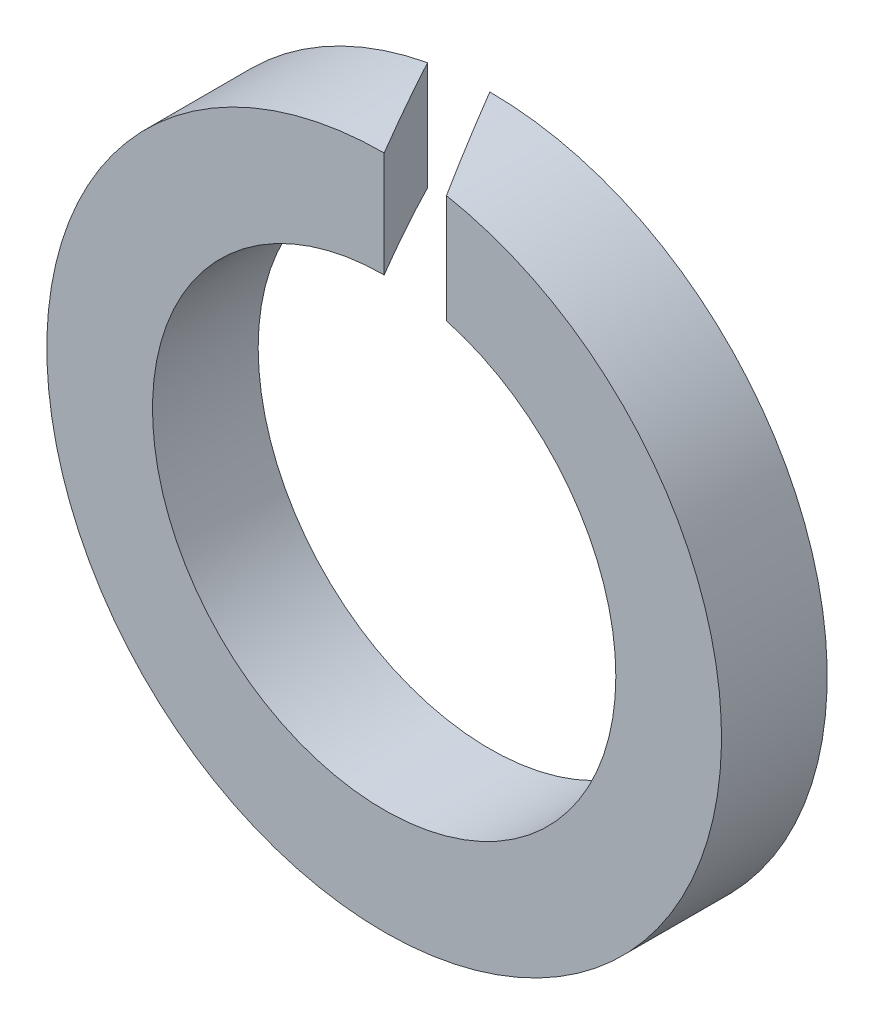
ISO-10303-21;
HEADER;
FILE_DESCRIPTION(('STEP AP214'),'2;1');
FILE_NAME('part.step','',(''),(''),'','','');
FILE_SCHEMA(('AUTOMOTIVE_DESIGN { 1 0 10303 214 1 1 1 1 }'));
ENDSEC;
DATA;
#1=APPLICATION_CONTEXT('core data for automotive mechanical design processes');
#2=APPLICATION_PROTOCOL_DEFINITION('international standard','automotive_design',2000,#1);
#3=PRODUCT_CONTEXT('',#1,'mechanical');
#4=PRODUCT('Part','Part','',(#3));
#5=PRODUCT_RELATED_PRODUCT_CATEGORY('part','',(#4));
#6=PRODUCT_DEFINITION_FORMATION('','',#4);
#7=PRODUCT_DEFINITION_CONTEXT('part definition',#1,'design');
#8=PRODUCT_DEFINITION('design','',#6,#7);
#9=PRODUCT_DEFINITION_SHAPE('','',#8);
#10=(LENGTH_UNIT() NAMED_UNIT(*) SI_UNIT(.MILLI.,.METRE.));
#11=(NAMED_UNIT(*) PLANE_ANGLE_UNIT() SI_UNIT($,.RADIAN.));
#12=(NAMED_UNIT(*) SI_UNIT($,.STERADIAN.) SOLID_ANGLE_UNIT());
#13=UNCERTAINTY_MEASURE_WITH_UNIT(LENGTH_MEASURE(1.E-05),#10,'distance_accuracy_value','');
#14=(GEOMETRIC_REPRESENTATION_CONTEXT(3) GLOBAL_UNCERTAINTY_ASSIGNED_CONTEXT((#13)) GLOBAL_UNIT_ASSIGNED_CONTEXT((#10,
#11,#12)) REPRESENTATION_CONTEXT('',''));
#15=CARTESIAN_POINT('',(0.,0.,0.));
#16=DIRECTION('',(0.,0.,1.));
#17=DIRECTION('',(1.,0.,0.));
#18=AXIS2_PLACEMENT_3D('',#15,#16,#17);
#19=CARTESIAN_POINT('',(0.,0.,-0.65));
#20=DIRECTION('',(0.,0.,1.));
#21=DIRECTION('',(1.,0.,0.));
#22=AXIS2_PLACEMENT_3D('',#19,#20,#21);
#23=PLANE('',#22);
#24=DIRECTION('',(0.,1.,0.));
#25=VECTOR('',#24,1.);
#26=CARTESIAN_POINT('',(-0.383035714285714,2.075,-0.65));
#27=LINE('',#26,#25);
#28=CARTESIAN_POINT('',(-0.383035714285714,1.37255551493615,-0.65));
#29=VERTEX_POINT('',#28);
#30=CARTESIAN_POINT('',(-0.383035714285714,2.03934024664391,-0.65));
#31=VERTEX_POINT('',#30);
#32=EDGE_CURVE('E61',#29,#31,#27,.T.);
#33=ORIENTED_EDGE('',*,*,#32,.F.);
#34=CARTESIAN_POINT('',(0.,0.,-0.65));
#35=DIRECTION('',(0.,0.,1.));
#36=DIRECTION('',(1.,0.,0.));
#37=AXIS2_PLACEMENT_3D('',#34,#35,#36);
#38=CIRCLE('',#37,1.425);
#39=CARTESIAN_POINT('',(0.,1.425,-0.65));
#40=VERTEX_POINT('',#39);
#41=EDGE_CURVE('E56',#29,#40,#38,.T.);
#42=ORIENTED_EDGE('',*,*,#41,.T.);
#43=DIRECTION('',(0.,1.,0.));
#44=VECTOR('',#43,1.);
#45=CARTESIAN_POINT('',(0.,2.075,-0.65));
#46=LINE('',#45,#44);
#47=CARTESIAN_POINT('',(0.,2.075,-0.65));
#48=VERTEX_POINT('',#47);
#49=EDGE_CURVE('E58',#48,#40,#46,.F.);
#50=ORIENTED_EDGE('',*,*,#49,.F.);
#51=CARTESIAN_POINT('',(0.,0.,-0.65));
#52=DIRECTION('',(0.,0.,1.));
#53=DIRECTION('',(1.,0.,0.));
#54=AXIS2_PLACEMENT_3D('',#51,#52,#53);
#55=CIRCLE('',#54,2.075);
#56=EDGE_CURVE('E70',#31,#48,#55,.T.);
#57=ORIENTED_EDGE('',*,*,#56,.F.);
#58=EDGE_LOOP('',(#33,#42,#50,#57));
#59=FACE_BOUND('',#58,.T.);
#60=ADVANCED_FACE('F16',(#59),#23,.F.);
#61=CARTESIAN_POINT('',(0.,2.075,0.));
#62=DIRECTION('',(0.861538461538462,0.,-0.507692307692308));
#63=DIRECTION('',(-0.507692307692308,0.,-0.861538461538462));
#64=AXIS2_PLACEMENT_3D('',#61,#62,#63);
#65=PLANE('',#64);
#66=ORIENTED_EDGE('',*,*,#32,.T.);
#67=CARTESIAN_POINT('',(0.,0.,0.));
#68=DIRECTION('',(0.861538461538462,0.,-0.507692307692308));
#69=DIRECTION('',(0.507692307692308,0.,0.861538461538462));
#70=AXIS2_PLACEMENT_3D('',#67,#68,#69);
#71=ELLIPSE('',#70,4.08712121212121,2.075);
#72=CARTESIAN_POINT('',(0.,2.075,0.));
#73=VERTEX_POINT('',#72);
#74=EDGE_CURVE('E77',#73,#31,#71,.F.);
#75=ORIENTED_EDGE('',*,*,#74,.F.);
#76=DIRECTION('',(0.,1.,0.));
#77=VECTOR('',#76,1.);
#78=CARTESIAN_POINT('',(0.,0.,0.));
#79=LINE('',#78,#77);
#80=CARTESIAN_POINT('',(0.,1.425,0.));
#81=VERTEX_POINT('',#80);
#82=EDGE_CURVE('E85',#81,#73,#79,.T.);
#83=ORIENTED_EDGE('',*,*,#82,.F.);
#84=CARTESIAN_POINT('',(0.,0.,0.));
#85=DIRECTION('',(0.861538461538462,0.,-0.507692307692308));
#86=DIRECTION('',(0.507692307692308,0.,0.861538461538462));
#87=AXIS2_PLACEMENT_3D('',#84,#85,#86);
#88=ELLIPSE('',#87,2.80681818181818,1.425);
#89=EDGE_CURVE('E19',#81,#29,#88,.F.);
#90=ORIENTED_EDGE('',*,*,#89,.T.);
#91=EDGE_LOOP('',(#66,#75,#83,#90));
#92=FACE_BOUND('',#91,.T.);
#93=ADVANCED_FACE('F89',(#92),#65,.T.);
#94=CARTESIAN_POINT('',(0.,0.,-0.65));
#95=DIRECTION('',(0.,0.,1.));
#96=DIRECTION('',(1.,0.,0.));
#97=AXIS2_PLACEMENT_3D('',#94,#95,#96);
#98=CYLINDRICAL_SURFACE('',#97,2.075);
#99=CARTESIAN_POINT('',(0.,0.,-0.65));
#100=DIRECTION('',(-0.861538461538462,0.,0.507692307692308));
#101=DIRECTION('',(0.507692307692308,0.,0.861538461538462));
#102=AXIS2_PLACEMENT_3D('',#99,#100,#101);
#103=ELLIPSE('',#102,4.08712121212121,2.075);
#104=CARTESIAN_POINT('',(0.383035714285714,2.03934024664391,0.));
#105=VERTEX_POINT('',#104);
#106=EDGE_CURVE('E69',#105,#48,#103,.T.);
#107=ORIENTED_EDGE('',*,*,#106,.F.);
#108=CARTESIAN_POINT('',(0.,0.,0.));
#109=DIRECTION('',(0.,0.,1.));
#110=DIRECTION('',(1.,0.,0.));
#111=AXIS2_PLACEMENT_3D('',#108,#109,#110);
#112=CIRCLE('',#111,2.075);
#113=EDGE_CURVE('E25',#73,#105,#112,.T.);
#114=ORIENTED_EDGE('',*,*,#113,.F.);
#115=ORIENTED_EDGE('',*,*,#74,.T.);
#116=ORIENTED_EDGE('',*,*,#56,.T.);
#117=EDGE_LOOP('',(#107,#114,#115,#116));
#118=FACE_BOUND('',#117,.T.);
#119=ADVANCED_FACE('F90',(#118),#98,.T.);
#120=CARTESIAN_POINT('',(0.,2.075,-0.65));
#121=DIRECTION('',(-0.861538461538462,0.,0.507692307692308));
#122=DIRECTION('',(0.507692307692308,0.,0.861538461538462));
#123=AXIS2_PLACEMENT_3D('',#120,#121,#122);
#124=PLANE('',#123);
#125=DIRECTION('',(0.,1.,0.));
#126=VECTOR('',#125,1.);
#127=CARTESIAN_POINT('',(0.383035714285714,0.,0.));
#128=LINE('',#127,#126);
#129=CARTESIAN_POINT('',(0.383035714285714,1.37255551493615,0.));
#130=VERTEX_POINT('',#129);
#131=EDGE_CURVE('E11',#105,#130,#128,.F.);
#132=ORIENTED_EDGE('',*,*,#131,.F.);
#133=ORIENTED_EDGE('',*,*,#106,.T.);
#134=ORIENTED_EDGE('',*,*,#49,.T.);
#135=CARTESIAN_POINT('',(0.,0.,-0.65));
#136=DIRECTION('',(-0.861538461538462,0.,0.507692307692308));
#137=DIRECTION('',(0.507692307692308,0.,0.861538461538462));
#138=AXIS2_PLACEMENT_3D('',#135,#136,#137);
#139=ELLIPSE('',#138,2.80681818181818,1.425);
#140=EDGE_CURVE('E62',#40,#130,#139,.F.);
#141=ORIENTED_EDGE('',*,*,#140,.T.);
#142=EDGE_LOOP('',(#132,#133,#134,#141));
#143=FACE_BOUND('',#142,.T.);
#144=ADVANCED_FACE('F67',(#143),#124,.T.);
#145=CARTESIAN_POINT('',(0.,0.,-0.65));
#146=DIRECTION('',(0.,0.,1.));
#147=DIRECTION('',(1.,0.,0.));
#148=AXIS2_PLACEMENT_3D('',#145,#146,#147);
#149=CYLINDRICAL_SURFACE('',#148,1.425);
#150=ORIENTED_EDGE('',*,*,#41,.F.);
#151=ORIENTED_EDGE('',*,*,#89,.F.);
#152=CARTESIAN_POINT('',(0.,0.,0.));
#153=DIRECTION('',(0.,0.,1.));
#154=DIRECTION('',(1.,0.,0.));
#155=AXIS2_PLACEMENT_3D('',#152,#153,#154);
#156=CIRCLE('',#155,1.425);
#157=EDGE_CURVE('E34',#130,#81,#156,.F.);
#158=ORIENTED_EDGE('',*,*,#157,.F.);
#159=ORIENTED_EDGE('',*,*,#140,.F.);
#160=EDGE_LOOP('',(#150,#151,#158,#159));
#161=FACE_BOUND('',#160,.T.);
#162=ADVANCED_FACE('F72',(#161),#149,.F.);
#163=CARTESIAN_POINT('',(0.,0.,0.));
#164=DIRECTION('',(0.,0.,1.));
#165=DIRECTION('',(1.,0.,0.));
#166=AXIS2_PLACEMENT_3D('',#163,#164,#165);
#167=PLANE('',#166);
#168=ORIENTED_EDGE('',*,*,#131,.T.);
#169=ORIENTED_EDGE('',*,*,#157,.T.);
#170=ORIENTED_EDGE('',*,*,#82,.T.);
#171=ORIENTED_EDGE('',*,*,#113,.T.);
#172=EDGE_LOOP('',(#168,#169,#170,#171));
#173=FACE_BOUND('',#172,.T.);
#174=ADVANCED_FACE('F88',(#173),#167,.T.);
#175=CLOSED_SHELL('',(#60,#93,#119,#144,#162,#174));
#176=MANIFOLD_SOLID_BREP('B1',#175);
#177=ADVANCED_BREP_SHAPE_REPRESENTATION('',(#18,#176),#14);
#178=SHAPE_DEFINITION_REPRESENTATION(#9,#177);
ENDSEC;
END-ISO-10303-21;
